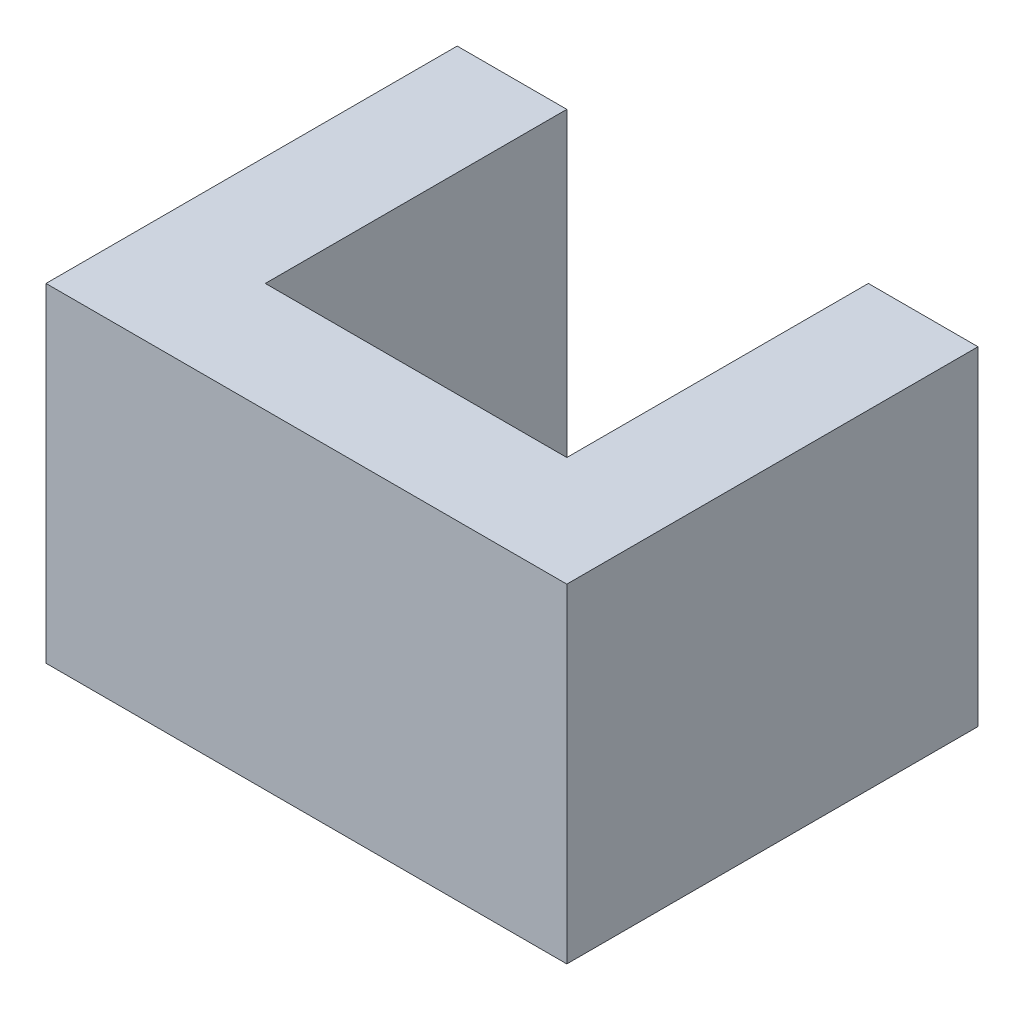
ISO-10303-21;
HEADER;
FILE_DESCRIPTION(('STEP AP214'),'2;1');
FILE_NAME('part.step','',(''),(''),'','','');
FILE_SCHEMA(('AUTOMOTIVE_DESIGN { 1 0 10303 214 1 1 1 1 }'));
ENDSEC;
DATA;
#1=APPLICATION_CONTEXT('core data for automotive mechanical design processes');
#2=APPLICATION_PROTOCOL_DEFINITION('international standard','automotive_design',2000,#1);
#3=PRODUCT_CONTEXT('',#1,'mechanical');
#4=PRODUCT('Part','Part','',(#3));
#5=PRODUCT_RELATED_PRODUCT_CATEGORY('part','',(#4));
#6=PRODUCT_DEFINITION_FORMATION('','',#4);
#7=PRODUCT_DEFINITION_CONTEXT('part definition',#1,'design');
#8=PRODUCT_DEFINITION('design','',#6,#7);
#9=PRODUCT_DEFINITION_SHAPE('','',#8);
#10=(LENGTH_UNIT() NAMED_UNIT(*) SI_UNIT(.MILLI.,.METRE.));
#11=(NAMED_UNIT(*) PLANE_ANGLE_UNIT() SI_UNIT($,.RADIAN.));
#12=(NAMED_UNIT(*) SI_UNIT($,.STERADIAN.) SOLID_ANGLE_UNIT());
#13=UNCERTAINTY_MEASURE_WITH_UNIT(LENGTH_MEASURE(1.E-05),#10,'distance_accuracy_value','');
#14=(GEOMETRIC_REPRESENTATION_CONTEXT(3) GLOBAL_UNCERTAINTY_ASSIGNED_CONTEXT((#13)) GLOBAL_UNIT_ASSIGNED_CONTEXT((#10,
#11,#12)) REPRESENTATION_CONTEXT('',''));
#15=CARTESIAN_POINT('',(0.,0.,0.));
#16=DIRECTION('',(0.,0.,1.));
#17=DIRECTION('',(1.,0.,0.));
#18=AXIS2_PLACEMENT_3D('',#15,#16,#17);
#19=CARTESIAN_POINT('',(-9.5,12.,0.));
#20=DIRECTION('',(1.,0.,0.));
#21=DIRECTION('',(0.,0.,-1.));
#22=AXIS2_PLACEMENT_3D('',#19,#20,#21);
#23=PLANE('',#22);
#24=DIRECTION('',(0.,0.,1.));
#25=VECTOR('',#24,1.);
#26=CARTESIAN_POINT('',(-9.5,0.,0.));
#27=LINE('',#26,#25);
#28=CARTESIAN_POINT('',(-9.5,0.,-15.));
#29=VERTEX_POINT('',#28);
#30=CARTESIAN_POINT('',(-9.5,0.,0.));
#31=VERTEX_POINT('',#30);
#32=EDGE_CURVE('E129',#29,#31,#27,.T.);
#33=ORIENTED_EDGE('',*,*,#32,.T.);
#34=DIRECTION('',(0.,-1.,0.));
#35=VECTOR('',#34,1.);
#36=CARTESIAN_POINT('',(-9.5,12.,0.));
#37=LINE('',#36,#35);
#38=CARTESIAN_POINT('',(-9.5,12.,0.));
#39=VERTEX_POINT('',#38);
#40=EDGE_CURVE('E11',#39,#31,#37,.T.);
#41=ORIENTED_EDGE('',*,*,#40,.F.);
#42=DIRECTION('',(0.,0.,1.));
#43=VECTOR('',#42,1.);
#44=CARTESIAN_POINT('',(-9.5,12.,0.));
#45=LINE('',#44,#43);
#46=CARTESIAN_POINT('',(-9.5,12.,-15.));
#47=VERTEX_POINT('',#46);
#48=EDGE_CURVE('E143',#47,#39,#45,.T.);
#49=ORIENTED_EDGE('',*,*,#48,.F.);
#50=DIRECTION('',(0.,-1.,0.));
#51=VECTOR('',#50,1.);
#52=CARTESIAN_POINT('',(-9.5,12.,-15.));
#53=LINE('',#52,#51);
#54=EDGE_CURVE('E125',#47,#29,#53,.T.);
#55=ORIENTED_EDGE('',*,*,#54,.T.);
#56=EDGE_LOOP('',(#33,#41,#49,#55));
#57=FACE_BOUND('',#56,.T.);
#58=ADVANCED_FACE('F33',(#57),#23,.F.);
#59=CARTESIAN_POINT('',(-9.5,12.,0.));
#60=DIRECTION('',(0.,0.,-1.));
#61=DIRECTION('',(-1.,0.,0.));
#62=AXIS2_PLACEMENT_3D('',#59,#60,#61);
#63=PLANE('',#62);
#64=DIRECTION('',(1.,0.,0.));
#65=VECTOR('',#64,1.);
#66=CARTESIAN_POINT('',(-9.5,0.,0.));
#67=LINE('',#66,#65);
#68=CARTESIAN_POINT('',(9.5,0.,0.));
#69=VERTEX_POINT('',#68);
#70=EDGE_CURVE('E132',#31,#69,#67,.T.);
#71=ORIENTED_EDGE('',*,*,#70,.T.);
#72=DIRECTION('',(0.,-1.,0.));
#73=VECTOR('',#72,1.);
#74=CARTESIAN_POINT('',(9.5,12.,0.));
#75=LINE('',#74,#73);
#76=CARTESIAN_POINT('',(9.5,12.,0.));
#77=VERTEX_POINT('',#76);
#78=EDGE_CURVE('E41',#77,#69,#75,.T.);
#79=ORIENTED_EDGE('',*,*,#78,.F.);
#80=DIRECTION('',(1.,0.,0.));
#81=VECTOR('',#80,1.);
#82=CARTESIAN_POINT('',(-9.5,12.,0.));
#83=LINE('',#82,#81);
#84=EDGE_CURVE('E92',#39,#77,#83,.T.);
#85=ORIENTED_EDGE('',*,*,#84,.F.);
#86=ORIENTED_EDGE('',*,*,#40,.T.);
#87=EDGE_LOOP('',(#71,#79,#85,#86));
#88=FACE_BOUND('',#87,.T.);
#89=ADVANCED_FACE('F178',(#88),#63,.F.);
#90=CARTESIAN_POINT('',(9.5,12.,0.));
#91=DIRECTION('',(-1.,0.,0.));
#92=DIRECTION('',(0.,0.,1.));
#93=AXIS2_PLACEMENT_3D('',#90,#91,#92);
#94=PLANE('',#93);
#95=DIRECTION('',(0.,0.,-1.));
#96=VECTOR('',#95,1.);
#97=CARTESIAN_POINT('',(9.5,0.,0.));
#98=LINE('',#97,#96);
#99=CARTESIAN_POINT('',(9.5,0.,-15.));
#100=VERTEX_POINT('',#99);
#101=EDGE_CURVE('E134',#69,#100,#98,.T.);
#102=ORIENTED_EDGE('',*,*,#101,.T.);
#103=DIRECTION('',(0.,-1.,0.));
#104=VECTOR('',#103,1.);
#105=CARTESIAN_POINT('',(9.5,12.,-15.));
#106=LINE('',#105,#104);
#107=CARTESIAN_POINT('',(9.5,12.,-15.));
#108=VERTEX_POINT('',#107);
#109=EDGE_CURVE('E150',#108,#100,#106,.T.);
#110=ORIENTED_EDGE('',*,*,#109,.F.);
#111=DIRECTION('',(0.,0.,-1.));
#112=VECTOR('',#111,1.);
#113=CARTESIAN_POINT('',(9.5,12.,0.));
#114=LINE('',#113,#112);
#115=EDGE_CURVE('E158',#77,#108,#114,.T.);
#116=ORIENTED_EDGE('',*,*,#115,.F.);
#117=ORIENTED_EDGE('',*,*,#78,.T.);
#118=EDGE_LOOP('',(#102,#110,#116,#117));
#119=FACE_BOUND('',#118,.T.);
#120=ADVANCED_FACE('F156',(#119),#94,.F.);
#121=CARTESIAN_POINT('',(5.5,12.,-15.));
#122=DIRECTION('',(0.,0.,1.));
#123=DIRECTION('',(1.,0.,0.));
#124=AXIS2_PLACEMENT_3D('',#121,#122,#123);
#125=PLANE('',#124);
#126=DIRECTION('',(-1.,0.,0.));
#127=VECTOR('',#126,1.);
#128=CARTESIAN_POINT('',(5.5,0.,-15.));
#129=LINE('',#128,#127);
#130=CARTESIAN_POINT('',(5.5,0.,-15.));
#131=VERTEX_POINT('',#130);
#132=EDGE_CURVE('E136',#100,#131,#129,.T.);
#133=ORIENTED_EDGE('',*,*,#132,.T.);
#134=DIRECTION('',(0.,-1.,0.));
#135=VECTOR('',#134,1.);
#136=CARTESIAN_POINT('',(5.5,12.,-15.));
#137=LINE('',#136,#135);
#138=CARTESIAN_POINT('',(5.5,12.,-15.));
#139=VERTEX_POINT('',#138);
#140=EDGE_CURVE('E147',#139,#131,#137,.T.);
#141=ORIENTED_EDGE('',*,*,#140,.F.);
#142=DIRECTION('',(-1.,0.,0.));
#143=VECTOR('',#142,1.);
#144=CARTESIAN_POINT('',(5.5,12.,-15.));
#145=LINE('',#144,#143);
#146=EDGE_CURVE('E170',#108,#139,#145,.T.);
#147=ORIENTED_EDGE('',*,*,#146,.F.);
#148=ORIENTED_EDGE('',*,*,#109,.T.);
#149=EDGE_LOOP('',(#133,#141,#147,#148));
#150=FACE_BOUND('',#149,.T.);
#151=ADVANCED_FACE('F166',(#150),#125,.F.);
#152=CARTESIAN_POINT('',(5.5,12.,-4.));
#153=DIRECTION('',(1.,0.,0.));
#154=DIRECTION('',(0.,0.,-1.));
#155=AXIS2_PLACEMENT_3D('',#152,#153,#154);
#156=PLANE('',#155);
#157=DIRECTION('',(0.,0.,1.));
#158=VECTOR('',#157,1.);
#159=CARTESIAN_POINT('',(5.5,0.,-4.));
#160=LINE('',#159,#158);
#161=CARTESIAN_POINT('',(5.5,0.,-4.));
#162=VERTEX_POINT('',#161);
#163=EDGE_CURVE('E138',#131,#162,#160,.T.);
#164=ORIENTED_EDGE('',*,*,#163,.T.);
#165=DIRECTION('',(0.,-1.,0.));
#166=VECTOR('',#165,1.);
#167=CARTESIAN_POINT('',(5.5,12.,-4.));
#168=LINE('',#167,#166);
#169=CARTESIAN_POINT('',(5.5,12.,-4.));
#170=VERTEX_POINT('',#169);
#171=EDGE_CURVE('E120',#170,#162,#168,.T.);
#172=ORIENTED_EDGE('',*,*,#171,.F.);
#173=DIRECTION('',(0.,0.,1.));
#174=VECTOR('',#173,1.);
#175=CARTESIAN_POINT('',(5.5,12.,-4.));
#176=LINE('',#175,#174);
#177=EDGE_CURVE('E111',#139,#170,#176,.T.);
#178=ORIENTED_EDGE('',*,*,#177,.F.);
#179=ORIENTED_EDGE('',*,*,#140,.T.);
#180=EDGE_LOOP('',(#164,#172,#178,#179));
#181=FACE_BOUND('',#180,.T.);
#182=ADVANCED_FACE('F169',(#181),#156,.F.);
#183=CARTESIAN_POINT('',(-5.5,12.,-4.));
#184=DIRECTION('',(0.,0.,1.));
#185=DIRECTION('',(1.,0.,0.));
#186=AXIS2_PLACEMENT_3D('',#183,#184,#185);
#187=PLANE('',#186);
#188=DIRECTION('',(-1.,0.,0.));
#189=VECTOR('',#188,1.);
#190=CARTESIAN_POINT('',(-5.5,0.,-4.));
#191=LINE('',#190,#189);
#192=CARTESIAN_POINT('',(-5.5,0.,-4.));
#193=VERTEX_POINT('',#192);
#194=EDGE_CURVE('E119',#162,#193,#191,.T.);
#195=ORIENTED_EDGE('',*,*,#194,.T.);
#196=DIRECTION('',(0.,-1.,0.));
#197=VECTOR('',#196,1.);
#198=CARTESIAN_POINT('',(-5.5,12.,-4.));
#199=LINE('',#198,#197);
#200=CARTESIAN_POINT('',(-5.5,12.,-4.));
#201=VERTEX_POINT('',#200);
#202=EDGE_CURVE('E116',#201,#193,#199,.T.);
#203=ORIENTED_EDGE('',*,*,#202,.F.);
#204=DIRECTION('',(-1.,0.,0.));
#205=VECTOR('',#204,1.);
#206=CARTESIAN_POINT('',(-5.5,12.,-4.));
#207=LINE('',#206,#205);
#208=EDGE_CURVE('E105',#170,#201,#207,.T.);
#209=ORIENTED_EDGE('',*,*,#208,.F.);
#210=ORIENTED_EDGE('',*,*,#171,.T.);
#211=EDGE_LOOP('',(#195,#203,#209,#210));
#212=FACE_BOUND('',#211,.T.);
#213=ADVANCED_FACE('F117',(#212),#187,.F.);
#214=CARTESIAN_POINT('',(-5.5,12.,-15.));
#215=DIRECTION('',(-1.,0.,0.));
#216=DIRECTION('',(0.,0.,1.));
#217=AXIS2_PLACEMENT_3D('',#214,#215,#216);
#218=PLANE('',#217);
#219=DIRECTION('',(0.,0.,-1.));
#220=VECTOR('',#219,1.);
#221=CARTESIAN_POINT('',(-5.5,0.,-15.));
#222=LINE('',#221,#220);
#223=CARTESIAN_POINT('',(-5.5,0.,-15.));
#224=VERTEX_POINT('',#223);
#225=EDGE_CURVE('E78',#193,#224,#222,.T.);
#226=ORIENTED_EDGE('',*,*,#225,.T.);
#227=DIRECTION('',(0.,-1.,0.));
#228=VECTOR('',#227,1.);
#229=CARTESIAN_POINT('',(-5.5,12.,-15.));
#230=LINE('',#229,#228);
#231=CARTESIAN_POINT('',(-5.5,12.,-15.));
#232=VERTEX_POINT('',#231);
#233=EDGE_CURVE('E121',#232,#224,#230,.T.);
#234=ORIENTED_EDGE('',*,*,#233,.F.);
#235=DIRECTION('',(0.,0.,-1.));
#236=VECTOR('',#235,1.);
#237=CARTESIAN_POINT('',(-5.5,12.,-15.));
#238=LINE('',#237,#236);
#239=EDGE_CURVE('E109',#201,#232,#238,.T.);
#240=ORIENTED_EDGE('',*,*,#239,.F.);
#241=ORIENTED_EDGE('',*,*,#202,.T.);
#242=EDGE_LOOP('',(#226,#234,#240,#241));
#243=FACE_BOUND('',#242,.T.);
#244=ADVANCED_FACE('F123',(#243),#218,.F.);
#245=CARTESIAN_POINT('',(-9.5,12.,-15.));
#246=DIRECTION('',(0.,0.,1.));
#247=DIRECTION('',(1.,0.,0.));
#248=AXIS2_PLACEMENT_3D('',#245,#246,#247);
#249=PLANE('',#248);
#250=DIRECTION('',(-1.,0.,0.));
#251=VECTOR('',#250,1.);
#252=CARTESIAN_POINT('',(-9.5,0.,-15.));
#253=LINE('',#252,#251);
#254=EDGE_CURVE('E84',#224,#29,#253,.T.);
#255=ORIENTED_EDGE('',*,*,#254,.T.);
#256=ORIENTED_EDGE('',*,*,#54,.F.);
#257=DIRECTION('',(-1.,0.,0.));
#258=VECTOR('',#257,1.);
#259=CARTESIAN_POINT('',(-9.5,12.,-15.));
#260=LINE('',#259,#258);
#261=EDGE_CURVE('E49',#232,#47,#260,.T.);
#262=ORIENTED_EDGE('',*,*,#261,.F.);
#263=ORIENTED_EDGE('',*,*,#233,.T.);
#264=EDGE_LOOP('',(#255,#256,#262,#263));
#265=FACE_BOUND('',#264,.T.);
#266=ADVANCED_FACE('F194',(#265),#249,.F.);
#267=CARTESIAN_POINT('',(0.,12.,0.));
#268=DIRECTION('',(0.,-1.,0.));
#269=DIRECTION('',(0.,0.,-1.));
#270=AXIS2_PLACEMENT_3D('',#267,#268,#269);
#271=PLANE('',#270);
#272=ORIENTED_EDGE('',*,*,#48,.T.);
#273=ORIENTED_EDGE('',*,*,#84,.T.);
#274=ORIENTED_EDGE('',*,*,#115,.T.);
#275=ORIENTED_EDGE('',*,*,#146,.T.);
#276=ORIENTED_EDGE('',*,*,#177,.T.);
#277=ORIENTED_EDGE('',*,*,#208,.T.);
#278=ORIENTED_EDGE('',*,*,#239,.T.);
#279=ORIENTED_EDGE('',*,*,#261,.T.);
#280=EDGE_LOOP('',(#272,#273,#274,#275,#276,#277,#278,#279));
#281=FACE_BOUND('',#280,.T.);
#282=ADVANCED_FACE('F107',(#281),#271,.F.);
#283=CARTESIAN_POINT('',(0.,0.,0.));
#284=DIRECTION('',(0.,-1.,0.));
#285=DIRECTION('',(0.,0.,-1.));
#286=AXIS2_PLACEMENT_3D('',#283,#284,#285);
#287=PLANE('',#286);
#288=ORIENTED_EDGE('',*,*,#32,.F.);
#289=ORIENTED_EDGE('',*,*,#254,.F.);
#290=ORIENTED_EDGE('',*,*,#225,.F.);
#291=ORIENTED_EDGE('',*,*,#194,.F.);
#292=ORIENTED_EDGE('',*,*,#163,.F.);
#293=ORIENTED_EDGE('',*,*,#132,.F.);
#294=ORIENTED_EDGE('',*,*,#101,.F.);
#295=ORIENTED_EDGE('',*,*,#70,.F.);
#296=EDGE_LOOP('',(#288,#289,#290,#291,#292,#293,#294,#295));
#297=FACE_BOUND('',#296,.T.);
#298=ADVANCED_FACE('F162',(#297),#287,.T.);
#299=CLOSED_SHELL('',(#58,#89,#120,#151,#182,#213,#244,#266,#282,#298));
#300=MANIFOLD_SOLID_BREP('B2',#299);
#301=ADVANCED_BREP_SHAPE_REPRESENTATION('',(#18,#300),#14);
#302=SHAPE_DEFINITION_REPRESENTATION(#9,#301);
ENDSEC;
END-ISO-10303-21;
